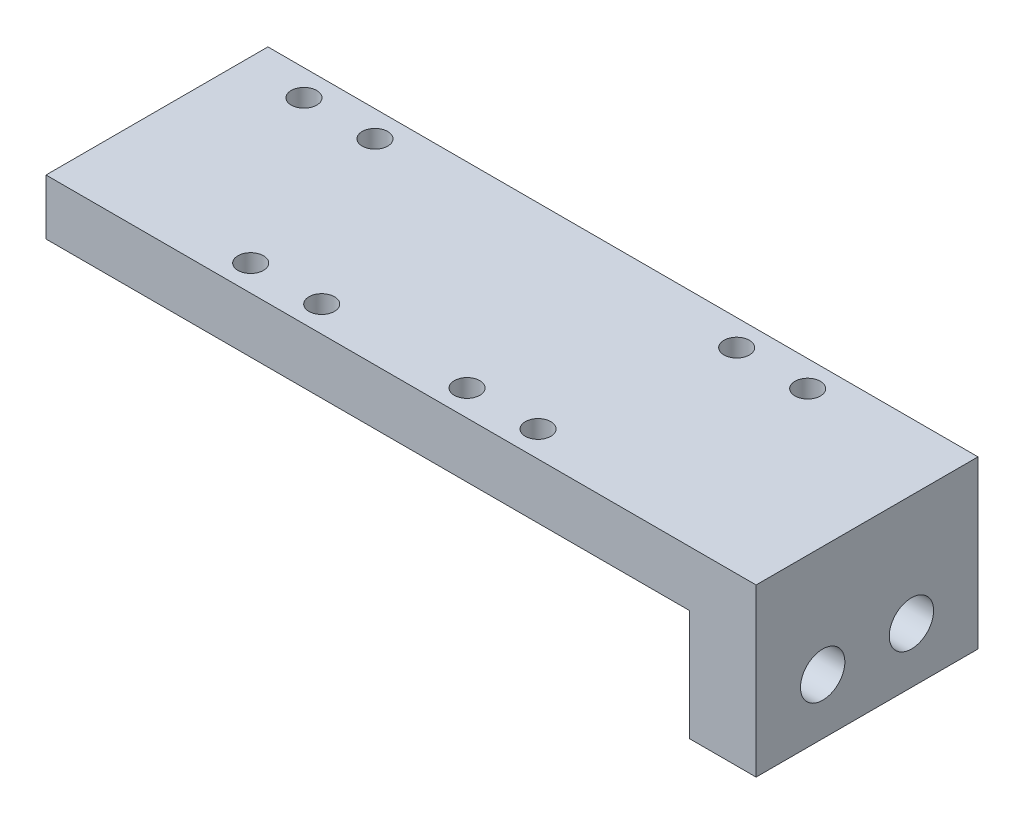
ISO-10303-21;
HEADER;
FILE_DESCRIPTION(('STEP AP214'),'2;1');
FILE_NAME('part.step','',(''),(''),'','','');
FILE_SCHEMA(('AUTOMOTIVE_DESIGN { 1 0 10303 214 1 1 1 1 }'));
ENDSEC;
DATA;
#1=APPLICATION_CONTEXT('core data for automotive mechanical design processes');
#2=APPLICATION_PROTOCOL_DEFINITION('international standard','automotive_design',2000,#1);
#3=PRODUCT_CONTEXT('',#1,'mechanical');
#4=PRODUCT('Part','Part','',(#3));
#5=PRODUCT_RELATED_PRODUCT_CATEGORY('part','',(#4));
#6=PRODUCT_DEFINITION_FORMATION('','',#4);
#7=PRODUCT_DEFINITION_CONTEXT('part definition',#1,'design');
#8=PRODUCT_DEFINITION('design','',#6,#7);
#9=PRODUCT_DEFINITION_SHAPE('','',#8);
#10=(LENGTH_UNIT() NAMED_UNIT(*) SI_UNIT(.MILLI.,.METRE.));
#11=(NAMED_UNIT(*) PLANE_ANGLE_UNIT() SI_UNIT($,.RADIAN.));
#12=(NAMED_UNIT(*) SI_UNIT($,.STERADIAN.) SOLID_ANGLE_UNIT());
#13=UNCERTAINTY_MEASURE_WITH_UNIT(LENGTH_MEASURE(1.E-05),#10,'distance_accuracy_value','');
#14=(GEOMETRIC_REPRESENTATION_CONTEXT(3) GLOBAL_UNCERTAINTY_ASSIGNED_CONTEXT((#13)) GLOBAL_UNIT_ASSIGNED_CONTEXT((#10,
#11,#12)) REPRESENTATION_CONTEXT('',''));
#15=CARTESIAN_POINT('',(0.,0.,0.));
#16=DIRECTION('',(0.,0.,1.));
#17=DIRECTION('',(1.,0.,0.));
#18=AXIS2_PLACEMENT_3D('',#15,#16,#17);
#19=CARTESIAN_POINT('',(6.,0.,10.));
#20=DIRECTION('',(0.,1.,0.));
#21=DIRECTION('',(-1.,0.,0.));
#22=AXIS2_PLACEMENT_3D('',#19,#20,#21);
#23=PLANE('',#22);
#24=DIRECTION('',(1.,0.,0.));
#25=VECTOR('',#24,1.);
#26=CARTESIAN_POINT('',(6.,0.,-10.));
#27=LINE('',#26,#25);
#28=CARTESIAN_POINT('',(0.,0.,-10.));
#29=VERTEX_POINT('',#28);
#30=CARTESIAN_POINT('',(6.,0.,-10.));
#31=VERTEX_POINT('',#30);
#32=EDGE_CURVE('E123',#29,#31,#27,.T.);
#33=ORIENTED_EDGE('',*,*,#32,.T.);
#34=DIRECTION('',(0.,0.,-1.));
#35=VECTOR('',#34,1.);
#36=CARTESIAN_POINT('',(6.,0.,10.));
#37=LINE('',#36,#35);
#38=CARTESIAN_POINT('',(6.,0.,10.));
#39=VERTEX_POINT('',#38);
#40=EDGE_CURVE('E11',#39,#31,#37,.T.);
#41=ORIENTED_EDGE('',*,*,#40,.F.);
#42=DIRECTION('',(1.,0.,0.));
#43=VECTOR('',#42,1.);
#44=CARTESIAN_POINT('',(6.,0.,10.));
#45=LINE('',#44,#43);
#46=CARTESIAN_POINT('',(0.,0.,10.));
#47=VERTEX_POINT('',#46);
#48=EDGE_CURVE('E134',#47,#39,#45,.T.);
#49=ORIENTED_EDGE('',*,*,#48,.F.);
#50=DIRECTION('',(0.,0.,-1.));
#51=VECTOR('',#50,1.);
#52=CARTESIAN_POINT('',(0.,0.,10.));
#53=LINE('',#52,#51);
#54=EDGE_CURVE('E119',#47,#29,#53,.T.);
#55=ORIENTED_EDGE('',*,*,#54,.T.);
#56=EDGE_LOOP('',(#33,#41,#49,#55));
#57=FACE_BOUND('',#56,.T.);
#58=ADVANCED_FACE('F37',(#57),#23,.F.);
#59=CARTESIAN_POINT('',(6.,15.,10.));
#60=DIRECTION('',(-1.,0.,0.));
#61=DIRECTION('',(0.,-1.,0.));
#62=AXIS2_PLACEMENT_3D('',#59,#60,#61);
#63=PLANE('',#62);
#64=CARTESIAN_POINT('',(6.,5.,-4.));
#65=DIRECTION('',(-1.,0.,0.));
#66=DIRECTION('',(0.,-1.,0.));
#67=AXIS2_PLACEMENT_3D('',#64,#65,#66);
#68=CIRCLE('',#67,2.);
#69=CARTESIAN_POINT('',(6.,3.,-4.));
#70=VERTEX_POINT('',#69);
#71=EDGE_CURVE('E127',#70,#70,#68,.T.);
#72=ORIENTED_EDGE('',*,*,#71,.T.);
#73=EDGE_LOOP('',(#72));
#74=FACE_BOUND('',#73,.T.);
#75=CARTESIAN_POINT('',(6.,5.,4.));
#76=DIRECTION('',(-1.,0.,0.));
#77=DIRECTION('',(0.,-1.,0.));
#78=AXIS2_PLACEMENT_3D('',#75,#76,#77);
#79=CIRCLE('',#78,2.);
#80=CARTESIAN_POINT('',(6.,3.,4.));
#81=VERTEX_POINT('',#80);
#82=EDGE_CURVE('E184',#81,#81,#79,.T.);
#83=ORIENTED_EDGE('',*,*,#82,.T.);
#84=EDGE_LOOP('',(#83));
#85=FACE_BOUND('',#84,.T.);
#86=DIRECTION('',(0.,1.,0.));
#87=VECTOR('',#86,1.);
#88=CARTESIAN_POINT('',(6.,15.,-10.));
#89=LINE('',#88,#87);
#90=CARTESIAN_POINT('',(6.,15.,-10.));
#91=VERTEX_POINT('',#90);
#92=EDGE_CURVE('E126',#31,#91,#89,.T.);
#93=ORIENTED_EDGE('',*,*,#92,.T.);
#94=DIRECTION('',(0.,0.,-1.));
#95=VECTOR('',#94,1.);
#96=CARTESIAN_POINT('',(6.,15.,10.));
#97=LINE('',#96,#95);
#98=CARTESIAN_POINT('',(6.,15.,10.));
#99=VERTEX_POINT('',#98);
#100=EDGE_CURVE('E46',#99,#91,#97,.T.);
#101=ORIENTED_EDGE('',*,*,#100,.F.);
#102=DIRECTION('',(0.,1.,0.));
#103=VECTOR('',#102,1.);
#104=CARTESIAN_POINT('',(6.,15.,10.));
#105=LINE('',#104,#103);
#106=EDGE_CURVE('E92',#39,#99,#105,.T.);
#107=ORIENTED_EDGE('',*,*,#106,.F.);
#108=ORIENTED_EDGE('',*,*,#40,.T.);
#109=EDGE_LOOP('',(#93,#101,#107,#108));
#110=FACE_BOUND('',#109,.T.);
#111=ADVANCED_FACE('F194',(#74,#85,#110),#63,.F.);
#112=CARTESIAN_POINT('',(-58.,15.,10.));
#113=DIRECTION('',(0.,-1.,0.));
#114=DIRECTION('',(0.,0.,-1.));
#115=AXIS2_PLACEMENT_3D('',#112,#113,#114);
#116=PLANE('',#115);
#117=CARTESIAN_POINT('',(-22.3999999999999,15.,7.65));
#118=DIRECTION('',(0.,-1.,0.));
#119=DIRECTION('',(0.,0.,-1.));
#120=AXIS2_PLACEMENT_3D('',#117,#118,#119);
#121=CIRCLE('',#120,1.15);
#122=CARTESIAN_POINT('',(-22.3999999999999,15.,6.5));
#123=VERTEX_POINT('',#122);
#124=EDGE_CURVE('E177',#123,#123,#121,.T.);
#125=ORIENTED_EDGE('',*,*,#124,.T.);
#126=EDGE_LOOP('',(#125));
#127=FACE_BOUND('',#126,.T.);
#128=CARTESIAN_POINT('',(-35.4999999999999,15.,7.65));
#129=DIRECTION('',(0.,-1.,0.));
#130=DIRECTION('',(0.,0.,-1.));
#131=AXIS2_PLACEMENT_3D('',#128,#129,#130);
#132=CIRCLE('',#131,1.15);
#133=CARTESIAN_POINT('',(-35.4999999999999,15.,6.50000000000001));
#134=VERTEX_POINT('',#133);
#135=EDGE_CURVE('E165',#134,#134,#132,.T.);
#136=ORIENTED_EDGE('',*,*,#135,.T.);
#137=EDGE_LOOP('',(#136));
#138=FACE_BOUND('',#137,.T.);
#139=CARTESIAN_POINT('',(-41.8999999999999,15.,7.65));
#140=DIRECTION('',(0.,-1.,0.));
#141=DIRECTION('',(0.,0.,-1.));
#142=AXIS2_PLACEMENT_3D('',#139,#140,#141);
#143=CIRCLE('',#142,1.15);
#144=CARTESIAN_POINT('',(-41.8999999999999,15.,6.5));
#145=VERTEX_POINT('',#144);
#146=EDGE_CURVE('E162',#145,#145,#143,.T.);
#147=ORIENTED_EDGE('',*,*,#146,.T.);
#148=EDGE_LOOP('',(#147));
#149=FACE_BOUND('',#148,.T.);
#150=CARTESIAN_POINT('',(-46.,15.,-7.65));
#151=DIRECTION('',(0.,-1.,0.));
#152=DIRECTION('',(0.,0.,-1.));
#153=AXIS2_PLACEMENT_3D('',#150,#151,#152);
#154=CIRCLE('',#153,1.15);
#155=CARTESIAN_POINT('',(-46.,15.,-8.8));
#156=VERTEX_POINT('',#155);
#157=EDGE_CURVE('E159',#156,#156,#154,.T.);
#158=ORIENTED_EDGE('',*,*,#157,.T.);
#159=EDGE_LOOP('',(#158));
#160=FACE_BOUND('',#159,.T.);
#161=CARTESIAN_POINT('',(-52.4,15.,-7.65));
#162=DIRECTION('',(0.,-1.,0.));
#163=DIRECTION('',(0.,0.,-1.));
#164=AXIS2_PLACEMENT_3D('',#161,#162,#163);
#165=CIRCLE('',#164,1.15);
#166=CARTESIAN_POINT('',(-52.4,15.,-8.8));
#167=VERTEX_POINT('',#166);
#168=EDGE_CURVE('E155',#167,#167,#165,.T.);
#169=ORIENTED_EDGE('',*,*,#168,.T.);
#170=EDGE_LOOP('',(#169));
#171=FACE_BOUND('',#170,.T.);
#172=CARTESIAN_POINT('',(-13.4,15.,-7.65));
#173=DIRECTION('',(0.,-1.,0.));
#174=DIRECTION('',(0.,0.,-1.));
#175=AXIS2_PLACEMENT_3D('',#172,#173,#174);
#176=CIRCLE('',#175,1.15);
#177=CARTESIAN_POINT('',(-13.4,15.,-8.8));
#178=VERTEX_POINT('',#177);
#179=EDGE_CURVE('E151',#178,#178,#176,.T.);
#180=ORIENTED_EDGE('',*,*,#179,.T.);
#181=EDGE_LOOP('',(#180));
#182=FACE_BOUND('',#181,.T.);
#183=CARTESIAN_POINT('',(-7.,15.,-7.65));
#184=DIRECTION('',(0.,-1.,0.));
#185=DIRECTION('',(0.,0.,-1.));
#186=AXIS2_PLACEMENT_3D('',#183,#184,#185);
#187=CIRCLE('',#186,1.15);
#188=CARTESIAN_POINT('',(-7.,15.,-8.8));
#189=VERTEX_POINT('',#188);
#190=EDGE_CURVE('E147',#189,#189,#187,.T.);
#191=ORIENTED_EDGE('',*,*,#190,.T.);
#192=EDGE_LOOP('',(#191));
#193=FACE_BOUND('',#192,.T.);
#194=CARTESIAN_POINT('',(-15.9999999999999,15.,7.65));
#195=DIRECTION('',(0.,-1.,0.));
#196=DIRECTION('',(0.,0.,-1.));
#197=AXIS2_PLACEMENT_3D('',#194,#195,#196);
#198=CIRCLE('',#197,1.15);
#199=CARTESIAN_POINT('',(-15.9999999999999,15.,6.50000000000001));
#200=VERTEX_POINT('',#199);
#201=EDGE_CURVE('E143',#200,#200,#198,.T.);
#202=ORIENTED_EDGE('',*,*,#201,.T.);
#203=EDGE_LOOP('',(#202));
#204=FACE_BOUND('',#203,.T.);
#205=DIRECTION('',(-1.,0.,0.));
#206=VECTOR('',#205,1.);
#207=CARTESIAN_POINT('',(-58.,15.,-10.));
#208=LINE('',#207,#206);
#209=CARTESIAN_POINT('',(-58.,15.,-10.));
#210=VERTEX_POINT('',#209);
#211=EDGE_CURVE('E129',#91,#210,#208,.T.);
#212=ORIENTED_EDGE('',*,*,#211,.T.);
#213=DIRECTION('',(0.,0.,-1.));
#214=VECTOR('',#213,1.);
#215=CARTESIAN_POINT('',(-58.,15.,10.));
#216=LINE('',#215,#214);
#217=CARTESIAN_POINT('',(-58.,15.,10.));
#218=VERTEX_POINT('',#217);
#219=EDGE_CURVE('E114',#218,#210,#216,.T.);
#220=ORIENTED_EDGE('',*,*,#219,.F.);
#221=DIRECTION('',(-1.,0.,0.));
#222=VECTOR('',#221,1.);
#223=CARTESIAN_POINT('',(-58.,15.,10.));
#224=LINE('',#223,#222);
#225=EDGE_CURVE('E105',#99,#218,#224,.T.);
#226=ORIENTED_EDGE('',*,*,#225,.F.);
#227=ORIENTED_EDGE('',*,*,#100,.T.);
#228=EDGE_LOOP('',(#212,#220,#226,#227));
#229=FACE_BOUND('',#228,.T.);
#230=ADVANCED_FACE('F197',(#127,#138,#149,#160,#171,#182,#193,#204,#229),#116,.F.);
#231=CARTESIAN_POINT('',(-58.,9.99999999999999,10.));
#232=DIRECTION('',(1.,0.,0.));
#233=DIRECTION('',(0.,0.,-1.));
#234=AXIS2_PLACEMENT_3D('',#231,#232,#233);
#235=PLANE('',#234);
#236=DIRECTION('',(0.,-1.,0.));
#237=VECTOR('',#236,1.);
#238=CARTESIAN_POINT('',(-58.,9.99999999999999,-10.));
#239=LINE('',#238,#237);
#240=CARTESIAN_POINT('',(-58.,9.99999999999999,-10.));
#241=VERTEX_POINT('',#240);
#242=EDGE_CURVE('E113',#210,#241,#239,.T.);
#243=ORIENTED_EDGE('',*,*,#242,.T.);
#244=DIRECTION('',(0.,0.,-1.));
#245=VECTOR('',#244,1.);
#246=CARTESIAN_POINT('',(-58.,9.99999999999999,10.));
#247=LINE('',#246,#245);
#248=CARTESIAN_POINT('',(-58.,9.99999999999999,10.));
#249=VERTEX_POINT('',#248);
#250=EDGE_CURVE('E110',#249,#241,#247,.T.);
#251=ORIENTED_EDGE('',*,*,#250,.F.);
#252=DIRECTION('',(0.,-1.,0.));
#253=VECTOR('',#252,1.);
#254=CARTESIAN_POINT('',(-58.,9.99999999999999,10.));
#255=LINE('',#254,#253);
#256=EDGE_CURVE('E99',#218,#249,#255,.T.);
#257=ORIENTED_EDGE('',*,*,#256,.F.);
#258=ORIENTED_EDGE('',*,*,#219,.T.);
#259=EDGE_LOOP('',(#243,#251,#257,#258));
#260=FACE_BOUND('',#259,.T.);
#261=ADVANCED_FACE('F111',(#260),#235,.F.);
#262=CARTESIAN_POINT('',(0.,10.,10.));
#263=DIRECTION('',(0.,1.,0.));
#264=DIRECTION('',(-1.,0.,0.));
#265=AXIS2_PLACEMENT_3D('',#262,#263,#264);
#266=PLANE('',#265);
#267=CARTESIAN_POINT('',(-22.3999999999999,10.,7.65));
#268=DIRECTION('',(0.,1.,0.));
#269=DIRECTION('',(-1.,0.,0.));
#270=AXIS2_PLACEMENT_3D('',#267,#268,#269);
#271=CIRCLE('',#270,1.15);
#272=CARTESIAN_POINT('',(-23.5499999999999,10.,7.65));
#273=VERTEX_POINT('',#272);
#274=EDGE_CURVE('E40',#273,#273,#271,.T.);
#275=ORIENTED_EDGE('',*,*,#274,.T.);
#276=EDGE_LOOP('',(#275));
#277=FACE_BOUND('',#276,.T.);
#278=CARTESIAN_POINT('',(-35.4999999999999,9.99999999999999,7.65));
#279=DIRECTION('',(0.,1.,0.));
#280=DIRECTION('',(-1.,0.,0.));
#281=AXIS2_PLACEMENT_3D('',#278,#279,#280);
#282=CIRCLE('',#281,1.15);
#283=CARTESIAN_POINT('',(-36.6499999999999,9.99999999999999,7.65));
#284=VERTEX_POINT('',#283);
#285=EDGE_CURVE('E163',#284,#284,#282,.T.);
#286=ORIENTED_EDGE('',*,*,#285,.T.);
#287=EDGE_LOOP('',(#286));
#288=FACE_BOUND('',#287,.T.);
#289=CARTESIAN_POINT('',(-41.8999999999999,9.99999999999999,7.65));
#290=DIRECTION('',(0.,1.,0.));
#291=DIRECTION('',(-1.,0.,0.));
#292=AXIS2_PLACEMENT_3D('',#289,#290,#291);
#293=CIRCLE('',#292,1.15);
#294=CARTESIAN_POINT('',(-43.0499999999999,9.99999999999999,7.65));
#295=VERTEX_POINT('',#294);
#296=EDGE_CURVE('E160',#295,#295,#293,.T.);
#297=ORIENTED_EDGE('',*,*,#296,.T.);
#298=EDGE_LOOP('',(#297));
#299=FACE_BOUND('',#298,.T.);
#300=CARTESIAN_POINT('',(-46.,9.99999999999999,-7.65));
#301=DIRECTION('',(0.,1.,0.));
#302=DIRECTION('',(-1.,0.,0.));
#303=AXIS2_PLACEMENT_3D('',#300,#301,#302);
#304=CIRCLE('',#303,1.15);
#305=CARTESIAN_POINT('',(-47.15,9.99999999999999,-7.65));
#306=VERTEX_POINT('',#305);
#307=EDGE_CURVE('E156',#306,#306,#304,.T.);
#308=ORIENTED_EDGE('',*,*,#307,.T.);
#309=EDGE_LOOP('',(#308));
#310=FACE_BOUND('',#309,.T.);
#311=CARTESIAN_POINT('',(-52.4,9.99999999999999,-7.65));
#312=DIRECTION('',(0.,1.,0.));
#313=DIRECTION('',(-1.,0.,0.));
#314=AXIS2_PLACEMENT_3D('',#311,#312,#313);
#315=CIRCLE('',#314,1.15);
#316=CARTESIAN_POINT('',(-53.55,9.99999999999999,-7.65));
#317=VERTEX_POINT('',#316);
#318=EDGE_CURVE('E152',#317,#317,#315,.T.);
#319=ORIENTED_EDGE('',*,*,#318,.T.);
#320=EDGE_LOOP('',(#319));
#321=FACE_BOUND('',#320,.T.);
#322=CARTESIAN_POINT('',(-13.4,10.,-7.65));
#323=DIRECTION('',(0.,1.,0.));
#324=DIRECTION('',(-1.,0.,0.));
#325=AXIS2_PLACEMENT_3D('',#322,#323,#324);
#326=CIRCLE('',#325,1.15);
#327=CARTESIAN_POINT('',(-14.55,10.,-7.65));
#328=VERTEX_POINT('',#327);
#329=EDGE_CURVE('E148',#328,#328,#326,.T.);
#330=ORIENTED_EDGE('',*,*,#329,.T.);
#331=EDGE_LOOP('',(#330));
#332=FACE_BOUND('',#331,.T.);
#333=CARTESIAN_POINT('',(-7.,10.,-7.65));
#334=DIRECTION('',(0.,1.,0.));
#335=DIRECTION('',(-1.,0.,0.));
#336=AXIS2_PLACEMENT_3D('',#333,#334,#335);
#337=CIRCLE('',#336,1.15);
#338=CARTESIAN_POINT('',(-8.15,10.,-7.65));
#339=VERTEX_POINT('',#338);
#340=EDGE_CURVE('E144',#339,#339,#337,.T.);
#341=ORIENTED_EDGE('',*,*,#340,.T.);
#342=EDGE_LOOP('',(#341));
#343=FACE_BOUND('',#342,.T.);
#344=CARTESIAN_POINT('',(-15.9999999999999,10.,7.65));
#345=DIRECTION('',(0.,1.,0.));
#346=DIRECTION('',(-1.,0.,0.));
#347=AXIS2_PLACEMENT_3D('',#344,#345,#346);
#348=CIRCLE('',#347,1.15);
#349=CARTESIAN_POINT('',(-17.1499999999999,10.,7.65));
#350=VERTEX_POINT('',#349);
#351=EDGE_CURVE('E140',#350,#350,#348,.T.);
#352=ORIENTED_EDGE('',*,*,#351,.T.);
#353=EDGE_LOOP('',(#352));
#354=FACE_BOUND('',#353,.T.);
#355=DIRECTION('',(1.,0.,0.));
#356=VECTOR('',#355,1.);
#357=CARTESIAN_POINT('',(0.,10.,-10.));
#358=LINE('',#357,#356);
#359=CARTESIAN_POINT('',(0.,10.,-10.));
#360=VERTEX_POINT('',#359);
#361=EDGE_CURVE('E78',#241,#360,#358,.T.);
#362=ORIENTED_EDGE('',*,*,#361,.T.);
#363=DIRECTION('',(0.,0.,-1.));
#364=VECTOR('',#363,1.);
#365=CARTESIAN_POINT('',(0.,10.,10.));
#366=LINE('',#365,#364);
#367=CARTESIAN_POINT('',(0.,10.,10.));
#368=VERTEX_POINT('',#367);
#369=EDGE_CURVE('E115',#368,#360,#366,.T.);
#370=ORIENTED_EDGE('',*,*,#369,.F.);
#371=DIRECTION('',(1.,0.,0.));
#372=VECTOR('',#371,1.);
#373=CARTESIAN_POINT('',(0.,10.,10.));
#374=LINE('',#373,#372);
#375=EDGE_CURVE('E103',#249,#368,#374,.T.);
#376=ORIENTED_EDGE('',*,*,#375,.F.);
#377=ORIENTED_EDGE('',*,*,#250,.T.);
#378=EDGE_LOOP('',(#362,#370,#376,#377));
#379=FACE_BOUND('',#378,.T.);
#380=ADVANCED_FACE('F117',(#277,#288,#299,#310,#321,#332,#343,#354,#379),#266,.F.);
#381=CARTESIAN_POINT('',(0.,0.,10.));
#382=DIRECTION('',(1.,0.,0.));
#383=DIRECTION('',(0.,1.,0.));
#384=AXIS2_PLACEMENT_3D('',#381,#382,#383);
#385=PLANE('',#384);
#386=CARTESIAN_POINT('',(0.,5.,-4.));
#387=DIRECTION('',(-1.,0.,0.));
#388=DIRECTION('',(0.,-1.,0.));
#389=AXIS2_PLACEMENT_3D('',#386,#387,#388);
#390=CIRCLE('',#389,2.);
#391=CARTESIAN_POINT('',(0.,3.,-4.));
#392=VERTEX_POINT('',#391);
#393=EDGE_CURVE('E181',#392,#392,#390,.T.);
#394=ORIENTED_EDGE('',*,*,#393,.F.);
#395=EDGE_LOOP('',(#394));
#396=FACE_BOUND('',#395,.T.);
#397=CARTESIAN_POINT('',(0.,5.,4.));
#398=DIRECTION('',(-1.,0.,0.));
#399=DIRECTION('',(0.,-1.,0.));
#400=AXIS2_PLACEMENT_3D('',#397,#398,#399);
#401=CIRCLE('',#400,2.);
#402=CARTESIAN_POINT('',(0.,3.,4.));
#403=VERTEX_POINT('',#402);
#404=EDGE_CURVE('E180',#403,#403,#401,.T.);
#405=ORIENTED_EDGE('',*,*,#404,.F.);
#406=EDGE_LOOP('',(#405));
#407=FACE_BOUND('',#406,.T.);
#408=DIRECTION('',(0.,-1.,0.));
#409=VECTOR('',#408,1.);
#410=CARTESIAN_POINT('',(0.,0.,-10.));
#411=LINE('',#410,#409);
#412=EDGE_CURVE('E84',#360,#29,#411,.T.);
#413=ORIENTED_EDGE('',*,*,#412,.T.);
#414=ORIENTED_EDGE('',*,*,#54,.F.);
#415=DIRECTION('',(0.,-1.,0.));
#416=VECTOR('',#415,1.);
#417=CARTESIAN_POINT('',(0.,0.,10.));
#418=LINE('',#417,#416);
#419=EDGE_CURVE('E55',#368,#47,#418,.T.);
#420=ORIENTED_EDGE('',*,*,#419,.F.);
#421=ORIENTED_EDGE('',*,*,#369,.T.);
#422=EDGE_LOOP('',(#413,#414,#420,#421));
#423=FACE_BOUND('',#422,.T.);
#424=ADVANCED_FACE('F202',(#396,#407,#423),#385,.F.);
#425=CARTESIAN_POINT('',(0.,0.,10.));
#426=DIRECTION('',(0.,0.,-1.));
#427=DIRECTION('',(-1.,0.,0.));
#428=AXIS2_PLACEMENT_3D('',#425,#426,#427);
#429=PLANE('',#428);
#430=ORIENTED_EDGE('',*,*,#48,.T.);
#431=ORIENTED_EDGE('',*,*,#106,.T.);
#432=ORIENTED_EDGE('',*,*,#225,.T.);
#433=ORIENTED_EDGE('',*,*,#256,.T.);
#434=ORIENTED_EDGE('',*,*,#375,.T.);
#435=ORIENTED_EDGE('',*,*,#419,.T.);
#436=EDGE_LOOP('',(#430,#431,#432,#433,#434,#435));
#437=FACE_BOUND('',#436,.T.);
#438=ADVANCED_FACE('F101',(#437),#429,.F.);
#439=CARTESIAN_POINT('',(0.,0.,-10.));
#440=DIRECTION('',(0.,0.,-1.));
#441=DIRECTION('',(-1.,0.,0.));
#442=AXIS2_PLACEMENT_3D('',#439,#440,#441);
#443=PLANE('',#442);
#444=ORIENTED_EDGE('',*,*,#32,.F.);
#445=ORIENTED_EDGE('',*,*,#412,.F.);
#446=ORIENTED_EDGE('',*,*,#361,.F.);
#447=ORIENTED_EDGE('',*,*,#242,.F.);
#448=ORIENTED_EDGE('',*,*,#211,.F.);
#449=ORIENTED_EDGE('',*,*,#92,.F.);
#450=EDGE_LOOP('',(#444,#445,#446,#447,#448,#449));
#451=FACE_BOUND('',#450,.T.);
#452=ADVANCED_FACE('F200',(#451),#443,.T.);
#453=CARTESIAN_POINT('',(8.,5.,4.));
#454=DIRECTION('',(-1.,0.,0.));
#455=DIRECTION('',(0.,-1.,0.));
#456=AXIS2_PLACEMENT_3D('',#453,#454,#455);
#457=CYLINDRICAL_SURFACE('',#456,2.);
#458=ORIENTED_EDGE('',*,*,#404,.T.);
#459=EDGE_LOOP('',(#458));
#460=FACE_BOUND('',#459,.T.);
#461=ORIENTED_EDGE('',*,*,#82,.F.);
#462=EDGE_LOOP('',(#461));
#463=FACE_BOUND('',#462,.T.);
#464=ADVANCED_FACE('F349',(#460,#463),#457,.F.);
#465=CARTESIAN_POINT('',(8.,5.,-4.));
#466=DIRECTION('',(-1.,0.,0.));
#467=DIRECTION('',(0.,-1.,0.));
#468=AXIS2_PLACEMENT_3D('',#465,#466,#467);
#469=CYLINDRICAL_SURFACE('',#468,2.);
#470=ORIENTED_EDGE('',*,*,#393,.T.);
#471=EDGE_LOOP('',(#470));
#472=FACE_BOUND('',#471,.T.);
#473=ORIENTED_EDGE('',*,*,#71,.F.);
#474=EDGE_LOOP('',(#473));
#475=FACE_BOUND('',#474,.T.);
#476=ADVANCED_FACE('F254',(#472,#475),#469,.F.);
#477=CARTESIAN_POINT('',(-15.9999999999999,0.,7.65));
#478=DIRECTION('',(0.,1.,0.));
#479=DIRECTION('',(0.,0.,1.));
#480=AXIS2_PLACEMENT_3D('',#477,#478,#479);
#481=CYLINDRICAL_SURFACE('',#480,1.15);
#482=ORIENTED_EDGE('',*,*,#351,.F.);
#483=EDGE_LOOP('',(#482));
#484=FACE_BOUND('',#483,.T.);
#485=ORIENTED_EDGE('',*,*,#201,.F.);
#486=EDGE_LOOP('',(#485));
#487=FACE_BOUND('',#486,.T.);
#488=ADVANCED_FACE('F248',(#484,#487),#481,.F.);
#489=CARTESIAN_POINT('',(-7.,0.,-7.65));
#490=DIRECTION('',(0.,1.,0.));
#491=DIRECTION('',(0.,0.,1.));
#492=AXIS2_PLACEMENT_3D('',#489,#490,#491);
#493=CYLINDRICAL_SURFACE('',#492,1.15);
#494=ORIENTED_EDGE('',*,*,#340,.F.);
#495=EDGE_LOOP('',(#494));
#496=FACE_BOUND('',#495,.T.);
#497=ORIENTED_EDGE('',*,*,#190,.F.);
#498=EDGE_LOOP('',(#497));
#499=FACE_BOUND('',#498,.T.);
#500=ADVANCED_FACE('F253',(#496,#499),#493,.F.);
#501=CARTESIAN_POINT('',(-13.4,0.,-7.65));
#502=DIRECTION('',(0.,1.,0.));
#503=DIRECTION('',(0.,0.,1.));
#504=AXIS2_PLACEMENT_3D('',#501,#502,#503);
#505=CYLINDRICAL_SURFACE('',#504,1.15);
#506=ORIENTED_EDGE('',*,*,#329,.F.);
#507=EDGE_LOOP('',(#506));
#508=FACE_BOUND('',#507,.T.);
#509=ORIENTED_EDGE('',*,*,#179,.F.);
#510=EDGE_LOOP('',(#509));
#511=FACE_BOUND('',#510,.T.);
#512=ADVANCED_FACE('F267',(#508,#511),#505,.F.);
#513=CARTESIAN_POINT('',(-52.4,0.,-7.65));
#514=DIRECTION('',(0.,1.,0.));
#515=DIRECTION('',(0.,0.,1.));
#516=AXIS2_PLACEMENT_3D('',#513,#514,#515);
#517=CYLINDRICAL_SURFACE('',#516,1.15);
#518=ORIENTED_EDGE('',*,*,#318,.F.);
#519=EDGE_LOOP('',(#518));
#520=FACE_BOUND('',#519,.T.);
#521=ORIENTED_EDGE('',*,*,#168,.F.);
#522=EDGE_LOOP('',(#521));
#523=FACE_BOUND('',#522,.T.);
#524=ADVANCED_FACE('F278',(#520,#523),#517,.F.);
#525=CARTESIAN_POINT('',(-46.,0.,-7.65));
#526=DIRECTION('',(0.,1.,0.));
#527=DIRECTION('',(0.,0.,1.));
#528=AXIS2_PLACEMENT_3D('',#525,#526,#527);
#529=CYLINDRICAL_SURFACE('',#528,1.15);
#530=ORIENTED_EDGE('',*,*,#307,.F.);
#531=EDGE_LOOP('',(#530));
#532=FACE_BOUND('',#531,.T.);
#533=ORIENTED_EDGE('',*,*,#157,.F.);
#534=EDGE_LOOP('',(#533));
#535=FACE_BOUND('',#534,.T.);
#536=ADVANCED_FACE('F289',(#532,#535),#529,.F.);
#537=CARTESIAN_POINT('',(-41.8999999999999,0.,7.65));
#538=DIRECTION('',(0.,1.,0.));
#539=DIRECTION('',(0.,0.,1.));
#540=AXIS2_PLACEMENT_3D('',#537,#538,#539);
#541=CYLINDRICAL_SURFACE('',#540,1.15);
#542=ORIENTED_EDGE('',*,*,#296,.F.);
#543=EDGE_LOOP('',(#542));
#544=FACE_BOUND('',#543,.T.);
#545=ORIENTED_EDGE('',*,*,#146,.F.);
#546=EDGE_LOOP('',(#545));
#547=FACE_BOUND('',#546,.T.);
#548=ADVANCED_FACE('F300',(#544,#547),#541,.F.);
#549=CARTESIAN_POINT('',(-35.4999999999999,0.,7.65));
#550=DIRECTION('',(0.,1.,0.));
#551=DIRECTION('',(0.,0.,1.));
#552=AXIS2_PLACEMENT_3D('',#549,#550,#551);
#553=CYLINDRICAL_SURFACE('',#552,1.15);
#554=ORIENTED_EDGE('',*,*,#285,.F.);
#555=EDGE_LOOP('',(#554));
#556=FACE_BOUND('',#555,.T.);
#557=ORIENTED_EDGE('',*,*,#135,.F.);
#558=EDGE_LOOP('',(#557));
#559=FACE_BOUND('',#558,.T.);
#560=ADVANCED_FACE('F311',(#556,#559),#553,.F.);
#561=CARTESIAN_POINT('',(-22.3999999999999,0.,7.65));
#562=DIRECTION('',(0.,1.,0.));
#563=DIRECTION('',(0.,0.,1.));
#564=AXIS2_PLACEMENT_3D('',#561,#562,#563);
#565=CYLINDRICAL_SURFACE('',#564,1.15);
#566=ORIENTED_EDGE('',*,*,#274,.F.);
#567=EDGE_LOOP('',(#566));
#568=FACE_BOUND('',#567,.T.);
#569=ORIENTED_EDGE('',*,*,#124,.F.);
#570=EDGE_LOOP('',(#569));
#571=FACE_BOUND('',#570,.T.);
#572=ADVANCED_FACE('F322',(#568,#571),#565,.F.);
#573=CLOSED_SHELL('',(#58,#111,#230,#261,#380,#424,#438,#452,#464,#476,#488,#500,#512,#524,#536,
#548,#560,#572));
#574=MANIFOLD_SOLID_BREP('B2',#573);
#575=ADVANCED_BREP_SHAPE_REPRESENTATION('',(#18,#574),#14);
#576=SHAPE_DEFINITION_REPRESENTATION(#9,#575);
ENDSEC;
END-ISO-10303-21;
